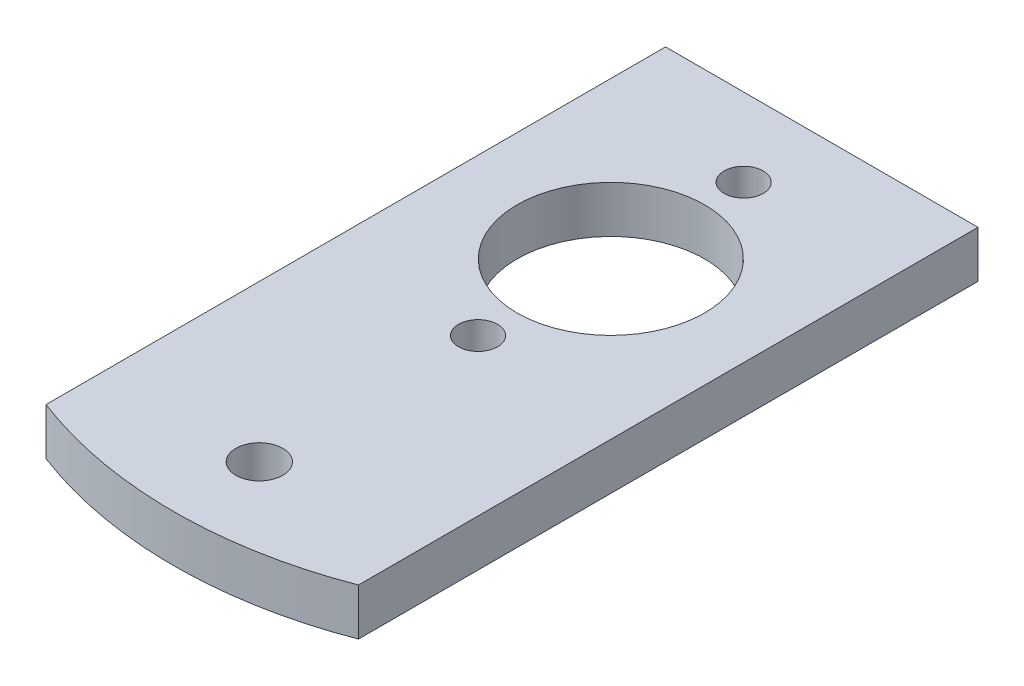
ISO-10303-21;
HEADER;
FILE_DESCRIPTION(('STEP AP214'),'2;1');
FILE_NAME('part.step','',(''),(''),'','','');
FILE_SCHEMA(('AUTOMOTIVE_DESIGN { 1 0 10303 214 1 1 1 1 }'));
ENDSEC;
DATA;
#1=APPLICATION_CONTEXT('core data for automotive mechanical design processes');
#2=APPLICATION_PROTOCOL_DEFINITION('international standard','automotive_design',2000,#1);
#3=PRODUCT_CONTEXT('',#1,'mechanical');
#4=PRODUCT('Part','Part','',(#3));
#5=PRODUCT_RELATED_PRODUCT_CATEGORY('part','',(#4));
#6=PRODUCT_DEFINITION_FORMATION('','',#4);
#7=PRODUCT_DEFINITION_CONTEXT('part definition',#1,'design');
#8=PRODUCT_DEFINITION('design','',#6,#7);
#9=PRODUCT_DEFINITION_SHAPE('','',#8);
#10=(LENGTH_UNIT() NAMED_UNIT(*) SI_UNIT(.MILLI.,.METRE.));
#11=(NAMED_UNIT(*) PLANE_ANGLE_UNIT() SI_UNIT($,.RADIAN.));
#12=(NAMED_UNIT(*) SI_UNIT($,.STERADIAN.) SOLID_ANGLE_UNIT());
#13=UNCERTAINTY_MEASURE_WITH_UNIT(LENGTH_MEASURE(1.E-05),#10,'distance_accuracy_value','');
#14=(GEOMETRIC_REPRESENTATION_CONTEXT(3) GLOBAL_UNCERTAINTY_ASSIGNED_CONTEXT((#13)) GLOBAL_UNIT_ASSIGNED_CONTEXT((#10,
#11,#12)) REPRESENTATION_CONTEXT('',''));
#15=CARTESIAN_POINT('',(0.,0.,0.));
#16=DIRECTION('',(0.,0.,1.));
#17=DIRECTION('',(1.,0.,0.));
#18=AXIS2_PLACEMENT_3D('',#15,#16,#17);
#19=CARTESIAN_POINT('',(0.,3.,0.));
#20=DIRECTION('',(0.,-1.,0.));
#21=DIRECTION('',(0.,0.,-1.));
#22=AXIS2_PLACEMENT_3D('',#19,#20,#21);
#23=PLANE('',#22);
#24=CARTESIAN_POINT('',(0.,3.,13.));
#25=DIRECTION('',(0.,1.,0.));
#26=DIRECTION('',(0.,0.,1.));
#27=AXIS2_PLACEMENT_3D('',#24,#25,#26);
#28=CIRCLE('',#27,1.5);
#29=CARTESIAN_POINT('',(0.,3.,14.5));
#30=VERTEX_POINT('',#29);
#31=EDGE_CURVE('E131',#30,#30,#28,.T.);
#32=ORIENTED_EDGE('',*,*,#31,.F.);
#33=EDGE_LOOP('',(#32));
#34=FACE_BOUND('',#33,.T.);
#35=CARTESIAN_POINT('',(0.,3.,-1.));
#36=DIRECTION('',(0.,1.,0.));
#37=DIRECTION('',(0.,0.,-1.));
#38=AXIS2_PLACEMENT_3D('',#35,#36,#37);
#39=CIRCLE('',#38,1.25);
#40=CARTESIAN_POINT('',(0.,3.,-2.25));
#41=VERTEX_POINT('',#40);
#42=EDGE_CURVE('E139',#41,#41,#39,.T.);
#43=ORIENTED_EDGE('',*,*,#42,.F.);
#44=EDGE_LOOP('',(#43));
#45=FACE_BOUND('',#44,.T.);
#46=CARTESIAN_POINT('',(0.,3.,-9.5));
#47=DIRECTION('',(0.,1.,0.));
#48=DIRECTION('',(0.,0.,1.));
#49=AXIS2_PLACEMENT_3D('',#46,#47,#48);
#50=CIRCLE('',#49,6.);
#51=CARTESIAN_POINT('',(0.,3.,-3.5));
#52=VERTEX_POINT('',#51);
#53=EDGE_CURVE('E147',#52,#52,#50,.T.);
#54=ORIENTED_EDGE('',*,*,#53,.F.);
#55=EDGE_LOOP('',(#54));
#56=FACE_BOUND('',#55,.T.);
#57=CARTESIAN_POINT('',(0.,3.,-18.));
#58=DIRECTION('',(0.,1.,0.));
#59=DIRECTION('',(0.,0.,1.));
#60=AXIS2_PLACEMENT_3D('',#57,#58,#59);
#61=CIRCLE('',#60,1.25);
#62=CARTESIAN_POINT('',(0.,3.,-16.75));
#63=VERTEX_POINT('',#62);
#64=EDGE_CURVE('E113',#63,#63,#61,.T.);
#65=ORIENTED_EDGE('',*,*,#64,.F.);
#66=EDGE_LOOP('',(#65));
#67=FACE_BOUND('',#66,.T.);
#68=CARTESIAN_POINT('',(0.,3.,-9.5));
#69=DIRECTION('',(0.,1.,0.));
#70=DIRECTION('',(0.,0.,1.));
#71=AXIS2_PLACEMENT_3D('',#68,#69,#70);
#72=CIRCLE('',#71,28.);
#73=CARTESIAN_POINT('',(-10.,3.,16.653393661244));
#74=VERTEX_POINT('',#73);
#75=CARTESIAN_POINT('',(10.,3.,16.653393661244));
#76=VERTEX_POINT('',#75);
#77=EDGE_CURVE('E43',#74,#76,#72,.T.);
#78=ORIENTED_EDGE('',*,*,#77,.T.);
#79=DIRECTION('',(0.,0.,-1.));
#80=VECTOR('',#79,1.);
#81=CARTESIAN_POINT('',(10.,3.,23.));
#82=LINE('',#81,#80);
#83=CARTESIAN_POINT('',(10.,3.,-23.));
#84=VERTEX_POINT('',#83);
#85=EDGE_CURVE('E87',#76,#84,#82,.T.);
#86=ORIENTED_EDGE('',*,*,#85,.T.);
#87=DIRECTION('',(-1.,0.,0.));
#88=VECTOR('',#87,1.);
#89=CARTESIAN_POINT('',(-10.,3.,-23.));
#90=LINE('',#89,#88);
#91=CARTESIAN_POINT('',(-10.,3.,-23.));
#92=VERTEX_POINT('',#91);
#93=EDGE_CURVE('E95',#84,#92,#90,.T.);
#94=ORIENTED_EDGE('',*,*,#93,.T.);
#95=DIRECTION('',(0.,0.,1.));
#96=VECTOR('',#95,1.);
#97=CARTESIAN_POINT('',(-10.,3.,23.));
#98=LINE('',#97,#96);
#99=EDGE_CURVE('E90',#92,#74,#98,.T.);
#100=ORIENTED_EDGE('',*,*,#99,.T.);
#101=EDGE_LOOP('',(#78,#86,#94,#100));
#102=FACE_BOUND('',#101,.T.);
#103=ADVANCED_FACE('F39',(#34,#45,#56,#67,#102),#23,.F.);
#104=CARTESIAN_POINT('',(0.,0.,0.));
#105=DIRECTION('',(0.,-1.,0.));
#106=DIRECTION('',(0.,0.,-1.));
#107=AXIS2_PLACEMENT_3D('',#104,#105,#106);
#108=PLANE('',#107);
#109=CARTESIAN_POINT('',(0.,0.,-1.));
#110=DIRECTION('',(0.,1.,0.));
#111=DIRECTION('',(0.,0.,-1.));
#112=AXIS2_PLACEMENT_3D('',#109,#110,#111);
#113=CIRCLE('',#112,1.25);
#114=CARTESIAN_POINT('',(0.,0.,-2.25));
#115=VERTEX_POINT('',#114);
#116=EDGE_CURVE('E135',#115,#115,#113,.T.);
#117=ORIENTED_EDGE('',*,*,#116,.T.);
#118=EDGE_LOOP('',(#117));
#119=FACE_BOUND('',#118,.T.);
#120=CARTESIAN_POINT('',(0.,0.,-18.));
#121=DIRECTION('',(0.,1.,0.));
#122=DIRECTION('',(0.,0.,1.));
#123=AXIS2_PLACEMENT_3D('',#120,#121,#122);
#124=CIRCLE('',#123,1.25);
#125=CARTESIAN_POINT('',(0.,0.,-16.75));
#126=VERTEX_POINT('',#125);
#127=EDGE_CURVE('E105',#126,#126,#124,.T.);
#128=ORIENTED_EDGE('',*,*,#127,.T.);
#129=EDGE_LOOP('',(#128));
#130=FACE_BOUND('',#129,.T.);
#131=CARTESIAN_POINT('',(0.,0.,-9.5));
#132=DIRECTION('',(0.,1.,0.));
#133=DIRECTION('',(0.,0.,1.));
#134=AXIS2_PLACEMENT_3D('',#131,#132,#133);
#135=CIRCLE('',#134,6.);
#136=CARTESIAN_POINT('',(0.,0.,-3.5));
#137=VERTEX_POINT('',#136);
#138=EDGE_CURVE('E143',#137,#137,#135,.T.);
#139=ORIENTED_EDGE('',*,*,#138,.T.);
#140=EDGE_LOOP('',(#139));
#141=FACE_BOUND('',#140,.T.);
#142=CARTESIAN_POINT('',(0.,0.,13.));
#143=DIRECTION('',(0.,1.,0.));
#144=DIRECTION('',(0.,0.,1.));
#145=AXIS2_PLACEMENT_3D('',#142,#143,#144);
#146=CIRCLE('',#145,1.5);
#147=CARTESIAN_POINT('',(0.,0.,14.5));
#148=VERTEX_POINT('',#147);
#149=EDGE_CURVE('E92',#148,#148,#146,.T.);
#150=ORIENTED_EDGE('',*,*,#149,.T.);
#151=EDGE_LOOP('',(#150));
#152=FACE_BOUND('',#151,.T.);
#153=DIRECTION('',(0.,0.,-1.));
#154=VECTOR('',#153,1.);
#155=CARTESIAN_POINT('',(10.,0.,23.));
#156=LINE('',#155,#154);
#157=CARTESIAN_POINT('',(10.,0.,16.653393661244));
#158=VERTEX_POINT('',#157);
#159=CARTESIAN_POINT('',(10.,0.,-23.));
#160=VERTEX_POINT('',#159);
#161=EDGE_CURVE('E110',#158,#160,#156,.T.);
#162=ORIENTED_EDGE('',*,*,#161,.F.);
#163=CARTESIAN_POINT('',(0.,0.,-9.5));
#164=DIRECTION('',(0.,1.,0.));
#165=DIRECTION('',(0.,0.,1.));
#166=AXIS2_PLACEMENT_3D('',#163,#164,#165);
#167=CIRCLE('',#166,28.);
#168=CARTESIAN_POINT('',(-10.,0.,16.653393661244));
#169=VERTEX_POINT('',#168);
#170=EDGE_CURVE('E75',#169,#158,#167,.T.);
#171=ORIENTED_EDGE('',*,*,#170,.F.);
#172=DIRECTION('',(0.,0.,1.));
#173=VECTOR('',#172,1.);
#174=CARTESIAN_POINT('',(-10.,0.,23.));
#175=LINE('',#174,#173);
#176=CARTESIAN_POINT('',(-10.,0.,-23.));
#177=VERTEX_POINT('',#176);
#178=EDGE_CURVE('E96',#177,#169,#175,.T.);
#179=ORIENTED_EDGE('',*,*,#178,.F.);
#180=DIRECTION('',(-1.,0.,0.));
#181=VECTOR('',#180,1.);
#182=CARTESIAN_POINT('',(-10.,0.,-23.));
#183=LINE('',#182,#181);
#184=EDGE_CURVE('E102',#160,#177,#183,.T.);
#185=ORIENTED_EDGE('',*,*,#184,.F.);
#186=EDGE_LOOP('',(#162,#171,#179,#185));
#187=FACE_BOUND('',#186,.T.);
#188=ADVANCED_FACE('F125',(#119,#130,#141,#152,#187),#108,.T.);
#189=CARTESIAN_POINT('',(10.,3.,23.));
#190=DIRECTION('',(-1.,0.,0.));
#191=DIRECTION('',(0.,0.,1.));
#192=AXIS2_PLACEMENT_3D('',#189,#190,#191);
#193=PLANE('',#192);
#194=DIRECTION('',(0.,1.,0.));
#195=VECTOR('',#194,1.);
#196=CARTESIAN_POINT('',(10.,0.,16.653393661244));
#197=LINE('',#196,#195);
#198=EDGE_CURVE('E77',#158,#76,#197,.T.);
#199=ORIENTED_EDGE('',*,*,#198,.F.);
#200=ORIENTED_EDGE('',*,*,#161,.T.);
#201=DIRECTION('',(0.,-1.,0.));
#202=VECTOR('',#201,1.);
#203=CARTESIAN_POINT('',(10.,3.,-23.));
#204=LINE('',#203,#202);
#205=EDGE_CURVE('E11',#84,#160,#204,.T.);
#206=ORIENTED_EDGE('',*,*,#205,.F.);
#207=ORIENTED_EDGE('',*,*,#85,.F.);
#208=EDGE_LOOP('',(#199,#200,#206,#207));
#209=FACE_BOUND('',#208,.T.);
#210=ADVANCED_FACE('F41',(#209),#193,.F.);
#211=CARTESIAN_POINT('',(-10.,3.,23.));
#212=DIRECTION('',(1.,0.,0.));
#213=DIRECTION('',(0.,0.,-1.));
#214=AXIS2_PLACEMENT_3D('',#211,#212,#213);
#215=PLANE('',#214);
#216=DIRECTION('',(0.,1.,0.));
#217=VECTOR('',#216,1.);
#218=CARTESIAN_POINT('',(-10.,0.,16.653393661244));
#219=LINE('',#218,#217);
#220=EDGE_CURVE('E83',#169,#74,#219,.T.);
#221=ORIENTED_EDGE('',*,*,#220,.T.);
#222=ORIENTED_EDGE('',*,*,#99,.F.);
#223=DIRECTION('',(0.,-1.,0.));
#224=VECTOR('',#223,1.);
#225=CARTESIAN_POINT('',(-10.,3.,-23.));
#226=LINE('',#225,#224);
#227=EDGE_CURVE('E50',#92,#177,#226,.T.);
#228=ORIENTED_EDGE('',*,*,#227,.T.);
#229=ORIENTED_EDGE('',*,*,#178,.T.);
#230=EDGE_LOOP('',(#221,#222,#228,#229));
#231=FACE_BOUND('',#230,.T.);
#232=ADVANCED_FACE('F121',(#231),#215,.F.);
#233=CARTESIAN_POINT('',(-10.,3.,-23.));
#234=DIRECTION('',(0.,0.,1.));
#235=DIRECTION('',(1.,0.,0.));
#236=AXIS2_PLACEMENT_3D('',#233,#234,#235);
#237=PLANE('',#236);
#238=ORIENTED_EDGE('',*,*,#184,.T.);
#239=ORIENTED_EDGE('',*,*,#227,.F.);
#240=ORIENTED_EDGE('',*,*,#93,.F.);
#241=ORIENTED_EDGE('',*,*,#205,.T.);
#242=EDGE_LOOP('',(#238,#239,#240,#241));
#243=FACE_BOUND('',#242,.T.);
#244=ADVANCED_FACE('F166',(#243),#237,.F.);
#245=CARTESIAN_POINT('',(0.,3.,-18.));
#246=DIRECTION('',(0.,-1.,0.));
#247=DIRECTION('',(0.,0.,-1.));
#248=AXIS2_PLACEMENT_3D('',#245,#246,#247);
#249=CYLINDRICAL_SURFACE('',#248,1.25);
#250=ORIENTED_EDGE('',*,*,#64,.T.);
#251=EDGE_LOOP('',(#250));
#252=FACE_BOUND('',#251,.T.);
#253=ORIENTED_EDGE('',*,*,#127,.F.);
#254=EDGE_LOOP('',(#253));
#255=FACE_BOUND('',#254,.T.);
#256=ADVANCED_FACE('F163',(#252,#255),#249,.F.);
#257=CARTESIAN_POINT('',(0.,3.,-9.5));
#258=DIRECTION('',(0.,-1.,0.));
#259=DIRECTION('',(0.,0.,-1.));
#260=AXIS2_PLACEMENT_3D('',#257,#258,#259);
#261=CYLINDRICAL_SURFACE('',#260,6.);
#262=ORIENTED_EDGE('',*,*,#53,.T.);
#263=EDGE_LOOP('',(#262));
#264=FACE_BOUND('',#263,.T.);
#265=ORIENTED_EDGE('',*,*,#138,.F.);
#266=EDGE_LOOP('',(#265));
#267=FACE_BOUND('',#266,.T.);
#268=ADVANCED_FACE('F165',(#264,#267),#261,.F.);
#269=CARTESIAN_POINT('',(0.,3.,-1.));
#270=DIRECTION('',(0.,-1.,0.));
#271=DIRECTION('',(0.,0.,-1.));
#272=AXIS2_PLACEMENT_3D('',#269,#270,#271);
#273=CYLINDRICAL_SURFACE('',#272,1.25);
#274=ORIENTED_EDGE('',*,*,#42,.T.);
#275=EDGE_LOOP('',(#274));
#276=FACE_BOUND('',#275,.T.);
#277=ORIENTED_EDGE('',*,*,#116,.F.);
#278=EDGE_LOOP('',(#277));
#279=FACE_BOUND('',#278,.T.);
#280=ADVANCED_FACE('F172',(#276,#279),#273,.F.);
#281=CARTESIAN_POINT('',(0.,3.,13.));
#282=DIRECTION('',(0.,-1.,0.));
#283=DIRECTION('',(0.,0.,-1.));
#284=AXIS2_PLACEMENT_3D('',#281,#282,#283);
#285=CYLINDRICAL_SURFACE('',#284,1.5);
#286=ORIENTED_EDGE('',*,*,#31,.T.);
#287=EDGE_LOOP('',(#286));
#288=FACE_BOUND('',#287,.T.);
#289=ORIENTED_EDGE('',*,*,#149,.F.);
#290=EDGE_LOOP('',(#289));
#291=FACE_BOUND('',#290,.T.);
#292=ADVANCED_FACE('F206',(#288,#291),#285,.F.);
#293=CARTESIAN_POINT('',(0.,0.,-9.5));
#294=DIRECTION('',(0.,1.,0.));
#295=DIRECTION('',(0.,0.,1.));
#296=AXIS2_PLACEMENT_3D('',#293,#294,#295);
#297=CYLINDRICAL_SURFACE('',#296,28.);
#298=ORIENTED_EDGE('',*,*,#77,.F.);
#299=ORIENTED_EDGE('',*,*,#220,.F.);
#300=ORIENTED_EDGE('',*,*,#170,.T.);
#301=ORIENTED_EDGE('',*,*,#198,.T.);
#302=EDGE_LOOP('',(#298,#299,#300,#301));
#303=FACE_BOUND('',#302,.T.);
#304=ADVANCED_FACE('F78',(#303),#297,.T.);
#305=CLOSED_SHELL('',(#103,#188,#210,#232,#244,#256,#268,#280,#292,#304));
#306=MANIFOLD_SOLID_BREP('B2',#305);
#307=ADVANCED_BREP_SHAPE_REPRESENTATION('',(#18,#306),#14);
#308=SHAPE_DEFINITION_REPRESENTATION(#9,#307);
ENDSEC;
END-ISO-10303-21;
